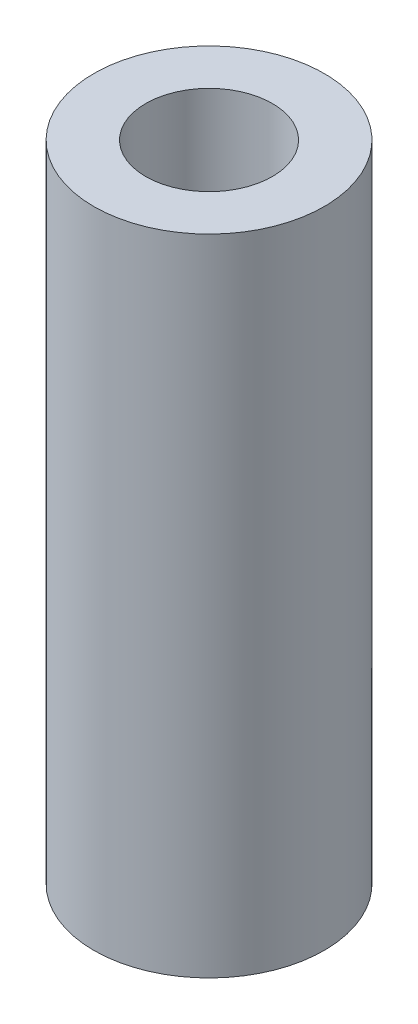
ISO-10303-21;
HEADER;
FILE_DESCRIPTION(('STEP AP214'),'2;1');
FILE_NAME('part.step','',(''),(''),'','','');
FILE_SCHEMA(('AUTOMOTIVE_DESIGN { 1 0 10303 214 1 1 1 1 }'));
ENDSEC;
DATA;
#1=APPLICATION_CONTEXT('core data for automotive mechanical design processes');
#2=APPLICATION_PROTOCOL_DEFINITION('international standard','automotive_design',2000,#1);
#3=PRODUCT_CONTEXT('',#1,'mechanical');
#4=PRODUCT('Part','Part','',(#3));
#5=PRODUCT_RELATED_PRODUCT_CATEGORY('part','',(#4));
#6=PRODUCT_DEFINITION_FORMATION('','',#4);
#7=PRODUCT_DEFINITION_CONTEXT('part definition',#1,'design');
#8=PRODUCT_DEFINITION('design','',#6,#7);
#9=PRODUCT_DEFINITION_SHAPE('','',#8);
#10=(LENGTH_UNIT() NAMED_UNIT(*) SI_UNIT(.MILLI.,.METRE.));
#11=(NAMED_UNIT(*) PLANE_ANGLE_UNIT() SI_UNIT($,.RADIAN.));
#12=(NAMED_UNIT(*) SI_UNIT($,.STERADIAN.) SOLID_ANGLE_UNIT());
#13=UNCERTAINTY_MEASURE_WITH_UNIT(LENGTH_MEASURE(1.E-05),#10,'distance_accuracy_value','');
#14=(GEOMETRIC_REPRESENTATION_CONTEXT(3) GLOBAL_UNCERTAINTY_ASSIGNED_CONTEXT((#13)) GLOBAL_UNIT_ASSIGNED_CONTEXT((#10,
#11,#12)) REPRESENTATION_CONTEXT('',''));
#15=CARTESIAN_POINT('',(0.,0.,0.));
#16=DIRECTION('',(0.,0.,1.));
#17=DIRECTION('',(1.,0.,0.));
#18=AXIS2_PLACEMENT_3D('',#15,#16,#17);
#19=CARTESIAN_POINT('',(0.,22.225,0.));
#20=DIRECTION('',(0.,1.,0.));
#21=DIRECTION('',(0.,0.,1.));
#22=AXIS2_PLACEMENT_3D('',#19,#20,#21);
#23=PLANE('',#22);
#24=CARTESIAN_POINT('',(0.,22.225,0.));
#25=DIRECTION('',(0.,1.,0.));
#26=DIRECTION('',(0.,0.,1.));
#27=AXIS2_PLACEMENT_3D('',#24,#25,#26);
#28=CIRCLE('',#27,3.9751);
#29=CARTESIAN_POINT('',(0.,22.225,3.9751));
#30=VERTEX_POINT('',#29);
#31=EDGE_CURVE('E10',#30,#30,#28,.T.);
#32=ORIENTED_EDGE('',*,*,#31,.T.);
#33=EDGE_LOOP('',(#32));
#34=FACE_BOUND('',#33,.T.);
#35=CARTESIAN_POINT('',(0.,22.225,0.));
#36=DIRECTION('',(0.,1.,0.));
#37=DIRECTION('',(0.,0.,1.));
#38=AXIS2_PLACEMENT_3D('',#35,#36,#37);
#39=CIRCLE('',#38,2.1844);
#40=CARTESIAN_POINT('',(0.,22.225,2.1844));
#41=VERTEX_POINT('',#40);
#42=EDGE_CURVE('E54',#41,#41,#39,.T.);
#43=ORIENTED_EDGE('',*,*,#42,.F.);
#44=EDGE_LOOP('',(#43));
#45=FACE_BOUND('',#44,.T.);
#46=ADVANCED_FACE('F41',(#34,#45),#23,.T.);
#47=CARTESIAN_POINT('',(0.,0.,0.));
#48=DIRECTION('',(0.,1.,0.));
#49=DIRECTION('',(0.,0.,1.));
#50=AXIS2_PLACEMENT_3D('',#47,#48,#49);
#51=PLANE('',#50);
#52=CARTESIAN_POINT('',(0.,0.,0.));
#53=DIRECTION('',(0.,1.,0.));
#54=DIRECTION('',(0.,0.,1.));
#55=AXIS2_PLACEMENT_3D('',#52,#53,#54);
#56=CIRCLE('',#55,3.9751);
#57=CARTESIAN_POINT('',(0.,0.,3.9751));
#58=VERTEX_POINT('',#57);
#59=EDGE_CURVE('E45',#58,#58,#56,.T.);
#60=ORIENTED_EDGE('',*,*,#59,.F.);
#61=EDGE_LOOP('',(#60));
#62=FACE_BOUND('',#61,.T.);
#63=CARTESIAN_POINT('',(0.,0.,0.));
#64=DIRECTION('',(0.,1.,0.));
#65=DIRECTION('',(0.,0.,1.));
#66=AXIS2_PLACEMENT_3D('',#63,#64,#65);
#67=CIRCLE('',#66,2.1844);
#68=CARTESIAN_POINT('',(0.,0.,2.1844));
#69=VERTEX_POINT('',#68);
#70=EDGE_CURVE('E56',#69,#69,#67,.T.);
#71=ORIENTED_EDGE('',*,*,#70,.T.);
#72=EDGE_LOOP('',(#71));
#73=FACE_BOUND('',#72,.T.);
#74=ADVANCED_FACE('F68',(#62,#73),#51,.F.);
#75=CARTESIAN_POINT('',(0.,22.225,0.));
#76=DIRECTION('',(0.,-1.,0.));
#77=DIRECTION('',(0.,0.,-1.));
#78=AXIS2_PLACEMENT_3D('',#75,#76,#77);
#79=CYLINDRICAL_SURFACE('',#78,3.9751);
#80=ORIENTED_EDGE('',*,*,#31,.F.);
#81=EDGE_LOOP('',(#80));
#82=FACE_BOUND('',#81,.T.);
#83=ORIENTED_EDGE('',*,*,#59,.T.);
#84=EDGE_LOOP('',(#83));
#85=FACE_BOUND('',#84,.T.);
#86=ADVANCED_FACE('F43',(#82,#85),#79,.T.);
#87=CARTESIAN_POINT('',(0.,22.225,0.));
#88=DIRECTION('',(0.,-1.,0.));
#89=DIRECTION('',(0.,0.,-1.));
#90=AXIS2_PLACEMENT_3D('',#87,#88,#89);
#91=CYLINDRICAL_SURFACE('',#90,2.1844);
#92=ORIENTED_EDGE('',*,*,#42,.T.);
#93=EDGE_LOOP('',(#92));
#94=FACE_BOUND('',#93,.T.);
#95=ORIENTED_EDGE('',*,*,#70,.F.);
#96=EDGE_LOOP('',(#95));
#97=FACE_BOUND('',#96,.T.);
#98=ADVANCED_FACE('F64',(#94,#97),#91,.F.);
#99=CLOSED_SHELL('',(#46,#74,#86,#98));
#100=MANIFOLD_SOLID_BREP('B2',#99);
#101=ADVANCED_BREP_SHAPE_REPRESENTATION('',(#18,#100),#14);
#102=SHAPE_DEFINITION_REPRESENTATION(#9,#101);
ENDSEC;
END-ISO-10303-21;
